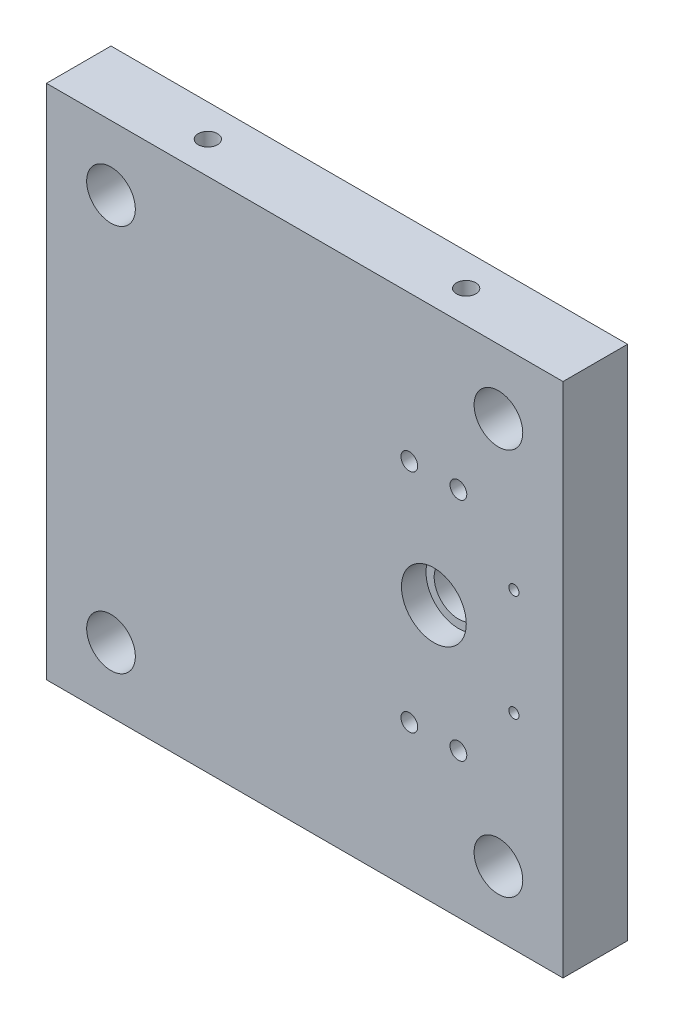
ISO-10303-21;
HEADER;
FILE_DESCRIPTION(('STEP AP214'),'2;1');
FILE_NAME('part.step','',(''),(''),'','','');
FILE_SCHEMA(('AUTOMOTIVE_DESIGN { 1 0 10303 214 1 1 1 1 }'));
ENDSEC;
DATA;
#1=APPLICATION_CONTEXT('core data for automotive mechanical design processes');
#2=APPLICATION_PROTOCOL_DEFINITION('international standard','automotive_design',2000,#1);
#3=PRODUCT_CONTEXT('',#1,'mechanical');
#4=PRODUCT('Part','Part','',(#3));
#5=PRODUCT_RELATED_PRODUCT_CATEGORY('part','',(#4));
#6=PRODUCT_DEFINITION_FORMATION('','',#4);
#7=PRODUCT_DEFINITION_CONTEXT('part definition',#1,'design');
#8=PRODUCT_DEFINITION('design','',#6,#7);
#9=PRODUCT_DEFINITION_SHAPE('','',#8);
#10=(LENGTH_UNIT() NAMED_UNIT(*) SI_UNIT(.MILLI.,.METRE.));
#11=(NAMED_UNIT(*) PLANE_ANGLE_UNIT() SI_UNIT($,.RADIAN.));
#12=(NAMED_UNIT(*) SI_UNIT($,.STERADIAN.) SOLID_ANGLE_UNIT());
#13=UNCERTAINTY_MEASURE_WITH_UNIT(LENGTH_MEASURE(1.E-05),#10,'distance_accuracy_value','');
#14=(GEOMETRIC_REPRESENTATION_CONTEXT(3) GLOBAL_UNCERTAINTY_ASSIGNED_CONTEXT((#13)) GLOBAL_UNIT_ASSIGNED_CONTEXT((#10,
#11,#12)) REPRESENTATION_CONTEXT('',''));
#15=CARTESIAN_POINT('',(0.,0.,0.));
#16=DIRECTION('',(0.,0.,1.));
#17=DIRECTION('',(1.,0.,0.));
#18=AXIS2_PLACEMENT_3D('',#15,#16,#17);
#19=CARTESIAN_POINT('',(-25.4,-38.1,6.35));
#20=DIRECTION('',(0.,-1.,0.));
#21=DIRECTION('',(0.,0.,-1.));
#22=AXIS2_PLACEMENT_3D('',#19,#20,#21);
#23=CONICAL_SURFACE('',#22,1.89864999999999,1.02974425867665);
#24=CARTESIAN_POINT('',(-25.4,-38.1,6.35));
#25=DIRECTION('',(0.,1.,0.));
#26=DIRECTION('',(0.,0.,1.));
#27=AXIS2_PLACEMENT_3D('',#24,#25,#26);
#28=CIRCLE('',#27,1.89865);
#29=CARTESIAN_POINT('',(-25.4,-38.1,8.24865));
#30=VERTEX_POINT('',#29);
#31=EDGE_CURVE('E190',#30,#30,#28,.F.);
#32=ORIENTED_EDGE('',*,*,#31,.T.);
#33=EDGE_LOOP('',(#32));
#34=FACE_BOUND('',#33,.T.);
#35=CARTESIAN_POINT('',(-25.4,-36.9591759856833,6.35));
#36=VERTEX_POINT('',#35);
#37=VERTEX_LOOP('',#36);
#38=FACE_BOUND('',#37,.T.);
#39=ADVANCED_FACE('F16',(#34,#38),#23,.F.);
#40=CARTESIAN_POINT('',(25.4,-38.1,6.35));
#41=DIRECTION('',(0.,-1.,0.));
#42=DIRECTION('',(0.,0.,-1.));
#43=AXIS2_PLACEMENT_3D('',#40,#41,#42);
#44=CONICAL_SURFACE('',#43,1.89865,1.02974425867665);
#45=CARTESIAN_POINT('',(25.4,-36.9591759856833,6.35));
#46=VERTEX_POINT('',#45);
#47=VERTEX_LOOP('',#46);
#48=FACE_BOUND('',#47,.T.);
#49=CARTESIAN_POINT('',(25.4,-38.1,6.35));
#50=DIRECTION('',(0.,-1.,0.));
#51=DIRECTION('',(0.,0.,-1.));
#52=AXIS2_PLACEMENT_3D('',#49,#50,#51);
#53=CIRCLE('',#52,1.89865);
#54=CARTESIAN_POINT('',(25.4,-38.1,4.45135));
#55=VERTEX_POINT('',#54);
#56=EDGE_CURVE('E185',#55,#55,#53,.T.);
#57=ORIENTED_EDGE('',*,*,#56,.T.);
#58=EDGE_LOOP('',(#57));
#59=FACE_BOUND('',#58,.T.);
#60=ADVANCED_FACE('F67',(#48,#59),#44,.F.);
#61=CARTESIAN_POINT('',(-25.4,38.1,6.35));
#62=DIRECTION('',(0.,1.,0.));
#63=DIRECTION('',(0.,0.,1.));
#64=AXIS2_PLACEMENT_3D('',#61,#62,#63);
#65=CONICAL_SURFACE('',#64,1.89865,1.02974425867665);
#66=CARTESIAN_POINT('',(-25.4,36.9591759856833,6.35));
#67=VERTEX_POINT('',#66);
#68=VERTEX_LOOP('',#67);
#69=FACE_BOUND('',#68,.T.);
#70=CARTESIAN_POINT('',(-25.4,38.1,6.35));
#71=DIRECTION('',(0.,1.,0.));
#72=DIRECTION('',(0.,0.,1.));
#73=AXIS2_PLACEMENT_3D('',#70,#71,#72);
#74=CIRCLE('',#73,1.89865);
#75=CARTESIAN_POINT('',(-25.4,38.1,8.24865));
#76=VERTEX_POINT('',#75);
#77=EDGE_CURVE('E183',#76,#76,#74,.T.);
#78=ORIENTED_EDGE('',*,*,#77,.T.);
#79=EDGE_LOOP('',(#78));
#80=FACE_BOUND('',#79,.T.);
#81=ADVANCED_FACE('F73',(#69,#80),#65,.F.);
#82=CARTESIAN_POINT('',(25.4,38.1,6.35));
#83=DIRECTION('',(0.,1.,0.));
#84=DIRECTION('',(0.,0.,1.));
#85=AXIS2_PLACEMENT_3D('',#82,#83,#84);
#86=CONICAL_SURFACE('',#85,1.89864999999999,1.02974425867665);
#87=CARTESIAN_POINT('',(25.4,38.1,6.35));
#88=DIRECTION('',(0.,-1.,0.));
#89=DIRECTION('',(0.,0.,-1.));
#90=AXIS2_PLACEMENT_3D('',#87,#88,#89);
#91=CIRCLE('',#90,1.89865);
#92=CARTESIAN_POINT('',(25.4,38.1,4.45135));
#93=VERTEX_POINT('',#92);
#94=EDGE_CURVE('E184',#93,#93,#91,.F.);
#95=ORIENTED_EDGE('',*,*,#94,.T.);
#96=EDGE_LOOP('',(#95));
#97=FACE_BOUND('',#96,.T.);
#98=CARTESIAN_POINT('',(25.4,36.9591759856833,6.35));
#99=VERTEX_POINT('',#98);
#100=VERTEX_LOOP('',#99);
#101=FACE_BOUND('',#100,.T.);
#102=ADVANCED_FACE('F171',(#97,#101),#86,.F.);
#103=CARTESIAN_POINT('',(25.4,0.,12.7));
#104=DIRECTION('',(0.,0.,1.));
#105=DIRECTION('',(1.,0.,0.));
#106=AXIS2_PLACEMENT_3D('',#103,#104,#105);
#107=CYLINDRICAL_SURFACE('',#106,6.3754);
#108=CARTESIAN_POINT('',(25.4,0.,7.874));
#109=DIRECTION('',(0.,0.,1.));
#110=DIRECTION('',(1.,0.,0.));
#111=AXIS2_PLACEMENT_3D('',#108,#109,#110);
#112=CIRCLE('',#111,6.3754);
#113=CARTESIAN_POINT('',(31.7754,0.,7.874));
#114=VERTEX_POINT('',#113);
#115=EDGE_CURVE('E19',#114,#114,#112,.T.);
#116=ORIENTED_EDGE('',*,*,#115,.F.);
#117=EDGE_LOOP('',(#116));
#118=FACE_BOUND('',#117,.T.);
#119=CARTESIAN_POINT('',(25.4,0.,12.7));
#120=DIRECTION('',(0.,0.,1.));
#121=DIRECTION('',(1.,0.,0.));
#122=AXIS2_PLACEMENT_3D('',#119,#120,#121);
#123=CIRCLE('',#122,6.3754);
#124=CARTESIAN_POINT('',(31.7754,0.,12.7));
#125=VERTEX_POINT('',#124);
#126=EDGE_CURVE('E272',#125,#125,#123,.F.);
#127=ORIENTED_EDGE('',*,*,#126,.F.);
#128=EDGE_LOOP('',(#127));
#129=FACE_BOUND('',#128,.T.);
#130=ADVANCED_FACE('F167',(#118,#129),#107,.F.);
#131=CARTESIAN_POINT('',(-25.4,-36.2671347849675,6.35));
#132=DIRECTION('',(0.,1.,0.));
#133=DIRECTION('',(0.,0.,1.));
#134=AXIS2_PLACEMENT_3D('',#131,#132,#133);
#135=CYLINDRICAL_SURFACE('',#134,1.89865);
#136=CARTESIAN_POINT('',(-25.4,-50.8,6.35));
#137=DIRECTION('',(0.,1.,0.));
#138=DIRECTION('',(0.,0.,1.));
#139=AXIS2_PLACEMENT_3D('',#136,#137,#138);
#140=CIRCLE('',#139,1.89865);
#141=CARTESIAN_POINT('',(-25.4,-50.8,8.24865));
#142=VERTEX_POINT('',#141);
#143=EDGE_CURVE('E269',#142,#142,#140,.T.);
#144=ORIENTED_EDGE('',*,*,#143,.F.);
#145=EDGE_LOOP('',(#144));
#146=FACE_BOUND('',#145,.T.);
#147=ORIENTED_EDGE('',*,*,#31,.F.);
#148=EDGE_LOOP('',(#147));
#149=FACE_BOUND('',#148,.T.);
#150=ADVANCED_FACE('F163',(#146,#149),#135,.F.);
#151=CARTESIAN_POINT('',(25.4,-36.2671347849675,6.35));
#152=DIRECTION('',(0.,-1.,0.));
#153=DIRECTION('',(0.,0.,-1.));
#154=AXIS2_PLACEMENT_3D('',#151,#152,#153);
#155=CYLINDRICAL_SURFACE('',#154,1.89865);
#156=ORIENTED_EDGE('',*,*,#56,.F.);
#157=EDGE_LOOP('',(#156));
#158=FACE_BOUND('',#157,.T.);
#159=CARTESIAN_POINT('',(25.4,-50.8,6.35));
#160=DIRECTION('',(0.,-1.,0.));
#161=DIRECTION('',(0.,0.,-1.));
#162=AXIS2_PLACEMENT_3D('',#159,#160,#161);
#163=CIRCLE('',#162,1.89865);
#164=CARTESIAN_POINT('',(25.4,-50.8,4.45135));
#165=VERTEX_POINT('',#164);
#166=EDGE_CURVE('E265',#165,#165,#163,.F.);
#167=ORIENTED_EDGE('',*,*,#166,.F.);
#168=EDGE_LOOP('',(#167));
#169=FACE_BOUND('',#168,.T.);
#170=ADVANCED_FACE('F159',(#158,#169),#155,.F.);
#171=CARTESIAN_POINT('',(-25.4,36.2671347849675,6.35));
#172=DIRECTION('',(0.,1.,0.));
#173=DIRECTION('',(0.,0.,1.));
#174=AXIS2_PLACEMENT_3D('',#171,#172,#173);
#175=CYLINDRICAL_SURFACE('',#174,1.89865);
#176=ORIENTED_EDGE('',*,*,#77,.F.);
#177=EDGE_LOOP('',(#176));
#178=FACE_BOUND('',#177,.T.);
#179=CARTESIAN_POINT('',(-25.4,50.8,6.35));
#180=DIRECTION('',(0.,1.,0.));
#181=DIRECTION('',(0.,0.,1.));
#182=AXIS2_PLACEMENT_3D('',#179,#180,#181);
#183=CIRCLE('',#182,1.89865);
#184=CARTESIAN_POINT('',(-25.4,50.8,8.24865));
#185=VERTEX_POINT('',#184);
#186=EDGE_CURVE('E262',#185,#185,#183,.F.);
#187=ORIENTED_EDGE('',*,*,#186,.F.);
#188=EDGE_LOOP('',(#187));
#189=FACE_BOUND('',#188,.T.);
#190=ADVANCED_FACE('F155',(#178,#189),#175,.F.);
#191=CARTESIAN_POINT('',(25.4,36.2671347849675,6.35));
#192=DIRECTION('',(0.,-1.,0.));
#193=DIRECTION('',(0.,0.,-1.));
#194=AXIS2_PLACEMENT_3D('',#191,#192,#193);
#195=CYLINDRICAL_SURFACE('',#194,1.89865);
#196=CARTESIAN_POINT('',(25.4,50.8,6.35));
#197=DIRECTION('',(0.,-1.,0.));
#198=DIRECTION('',(0.,0.,-1.));
#199=AXIS2_PLACEMENT_3D('',#196,#197,#198);
#200=CIRCLE('',#199,1.89865);
#201=CARTESIAN_POINT('',(25.4,50.8,4.45135));
#202=VERTEX_POINT('',#201);
#203=EDGE_CURVE('E259',#202,#202,#200,.T.);
#204=ORIENTED_EDGE('',*,*,#203,.F.);
#205=EDGE_LOOP('',(#204));
#206=FACE_BOUND('',#205,.T.);
#207=ORIENTED_EDGE('',*,*,#94,.F.);
#208=EDGE_LOOP('',(#207));
#209=FACE_BOUND('',#208,.T.);
#210=ADVANCED_FACE('F151',(#206,#209),#195,.F.);
#211=CARTESIAN_POINT('',(0.,0.,7.874));
#212=DIRECTION('',(0.,0.,1.));
#213=DIRECTION('',(1.,0.,0.));
#214=AXIS2_PLACEMENT_3D('',#211,#212,#213);
#215=PLANE('',#214);
#216=CARTESIAN_POINT('',(25.4,0.,7.874));
#217=DIRECTION('',(0.,0.,1.));
#218=DIRECTION('',(1.,0.,0.));
#219=AXIS2_PLACEMENT_3D('',#216,#217,#218);
#220=CIRCLE('',#219,4.7625);
#221=CARTESIAN_POINT('',(30.1625,0.,7.874));
#222=VERTEX_POINT('',#221);
#223=EDGE_CURVE('E244',#222,#222,#220,.F.);
#224=ORIENTED_EDGE('',*,*,#223,.T.);
#225=EDGE_LOOP('',(#224));
#226=FACE_BOUND('',#225,.T.);
#227=ORIENTED_EDGE('',*,*,#115,.T.);
#228=EDGE_LOOP('',(#227));
#229=FACE_BOUND('',#228,.T.);
#230=ADVANCED_FACE('F147',(#226,#229),#215,.T.);
#231=CARTESIAN_POINT('',(0.,0.,12.7));
#232=DIRECTION('',(0.,0.,1.));
#233=DIRECTION('',(1.,0.,0.));
#234=AXIS2_PLACEMENT_3D('',#231,#232,#233);
#235=PLANE('',#234);
#236=CARTESIAN_POINT('',(20.574,22.098,12.7));
#237=DIRECTION('',(0.,0.,-1.));
#238=DIRECTION('',(-1.,0.,0.));
#239=AXIS2_PLACEMENT_3D('',#236,#237,#238);
#240=CIRCLE('',#239,1.64973);
#241=CARTESIAN_POINT('',(18.92427,22.098,12.7));
#242=VERTEX_POINT('',#241);
#243=EDGE_CURVE('E225',#242,#242,#240,.T.);
#244=ORIENTED_EDGE('',*,*,#243,.T.);
#245=EDGE_LOOP('',(#244));
#246=FACE_BOUND('',#245,.T.);
#247=CARTESIAN_POINT('',(30.226,22.098,12.7));
#248=DIRECTION('',(0.,0.,-1.));
#249=DIRECTION('',(-1.,0.,0.));
#250=AXIS2_PLACEMENT_3D('',#247,#248,#249);
#251=CIRCLE('',#250,1.64973);
#252=CARTESIAN_POINT('',(28.57627,22.098,12.7));
#253=VERTEX_POINT('',#252);
#254=EDGE_CURVE('E229',#253,#253,#251,.T.);
#255=ORIENTED_EDGE('',*,*,#254,.T.);
#256=EDGE_LOOP('',(#255));
#257=FACE_BOUND('',#256,.T.);
#258=CARTESIAN_POINT('',(20.574,-22.352,12.7));
#259=DIRECTION('',(0.,0.,-1.));
#260=DIRECTION('',(-1.,0.,0.));
#261=AXIS2_PLACEMENT_3D('',#258,#259,#260);
#262=CIRCLE('',#261,1.64973);
#263=CARTESIAN_POINT('',(18.92427,-22.352,12.7));
#264=VERTEX_POINT('',#263);
#265=EDGE_CURVE('E232',#264,#264,#262,.T.);
#266=ORIENTED_EDGE('',*,*,#265,.T.);
#267=EDGE_LOOP('',(#266));
#268=FACE_BOUND('',#267,.T.);
#269=CARTESIAN_POINT('',(30.226,-22.352,12.7));
#270=DIRECTION('',(0.,0.,-1.));
#271=DIRECTION('',(-1.,0.,0.));
#272=AXIS2_PLACEMENT_3D('',#269,#270,#271);
#273=CIRCLE('',#272,1.64973);
#274=CARTESIAN_POINT('',(28.57627,-22.352,12.7));
#275=VERTEX_POINT('',#274);
#276=EDGE_CURVE('E235',#275,#275,#273,.T.);
#277=ORIENTED_EDGE('',*,*,#276,.T.);
#278=EDGE_LOOP('',(#277));
#279=FACE_BOUND('',#278,.T.);
#280=CARTESIAN_POINT('',(41.148,10.4775,12.7));
#281=DIRECTION('',(0.,0.,1.));
#282=DIRECTION('',(1.,0.,0.));
#283=AXIS2_PLACEMENT_3D('',#280,#281,#282);
#284=CIRCLE('',#283,0.9921875);
#285=CARTESIAN_POINT('',(42.1401875,10.4775,12.7));
#286=VERTEX_POINT('',#285);
#287=EDGE_CURVE('E238',#286,#286,#284,.F.);
#288=ORIENTED_EDGE('',*,*,#287,.T.);
#289=EDGE_LOOP('',(#288));
#290=FACE_BOUND('',#289,.T.);
#291=CARTESIAN_POINT('',(41.148,-10.4775,12.7));
#292=DIRECTION('',(0.,0.,1.));
#293=DIRECTION('',(1.,0.,0.));
#294=AXIS2_PLACEMENT_3D('',#291,#292,#293);
#295=CIRCLE('',#294,0.9921875);
#296=CARTESIAN_POINT('',(42.1401875,-10.4775,12.7));
#297=VERTEX_POINT('',#296);
#298=EDGE_CURVE('E241',#297,#297,#295,.F.);
#299=ORIENTED_EDGE('',*,*,#298,.T.);
#300=EDGE_LOOP('',(#299));
#301=FACE_BOUND('',#300,.T.);
#302=ORIENTED_EDGE('',*,*,#126,.T.);
#303=EDGE_LOOP('',(#302));
#304=FACE_BOUND('',#303,.T.);
#305=CARTESIAN_POINT('',(-38.1,-38.1,12.7));
#306=DIRECTION('',(0.,0.,1.));
#307=DIRECTION('',(1.,0.,0.));
#308=AXIS2_PLACEMENT_3D('',#305,#306,#307);
#309=CIRCLE('',#308,4.7879);
#310=CARTESIAN_POINT('',(-33.3121,-38.1,12.7));
#311=VERTEX_POINT('',#310);
#312=EDGE_CURVE('E247',#311,#311,#309,.F.);
#313=ORIENTED_EDGE('',*,*,#312,.T.);
#314=EDGE_LOOP('',(#313));
#315=FACE_BOUND('',#314,.T.);
#316=CARTESIAN_POINT('',(38.1,-38.1,12.7));
#317=DIRECTION('',(0.,0.,1.));
#318=DIRECTION('',(1.,0.,0.));
#319=AXIS2_PLACEMENT_3D('',#316,#317,#318);
#320=CIRCLE('',#319,4.7879);
#321=CARTESIAN_POINT('',(42.8879,-38.1,12.7));
#322=VERTEX_POINT('',#321);
#323=EDGE_CURVE('E250',#322,#322,#320,.F.);
#324=ORIENTED_EDGE('',*,*,#323,.T.);
#325=EDGE_LOOP('',(#324));
#326=FACE_BOUND('',#325,.T.);
#327=CARTESIAN_POINT('',(38.1,38.1,12.7));
#328=DIRECTION('',(0.,0.,1.));
#329=DIRECTION('',(1.,0.,0.));
#330=AXIS2_PLACEMENT_3D('',#327,#328,#329);
#331=CIRCLE('',#330,4.7879);
#332=CARTESIAN_POINT('',(42.8879,38.1,12.7));
#333=VERTEX_POINT('',#332);
#334=EDGE_CURVE('E253',#333,#333,#331,.F.);
#335=ORIENTED_EDGE('',*,*,#334,.T.);
#336=EDGE_LOOP('',(#335));
#337=FACE_BOUND('',#336,.T.);
#338=CARTESIAN_POINT('',(-38.1,38.1,12.7));
#339=DIRECTION('',(0.,0.,1.));
#340=DIRECTION('',(1.,0.,0.));
#341=AXIS2_PLACEMENT_3D('',#338,#339,#340);
#342=CIRCLE('',#341,4.7879);
#343=CARTESIAN_POINT('',(-33.3121,38.1,12.7));
#344=VERTEX_POINT('',#343);
#345=EDGE_CURVE('E256',#344,#344,#342,.F.);
#346=ORIENTED_EDGE('',*,*,#345,.T.);
#347=EDGE_LOOP('',(#346));
#348=FACE_BOUND('',#347,.T.);
#349=DIRECTION('',(1.,0.,0.));
#350=VECTOR('',#349,1.);
#351=CARTESIAN_POINT('',(50.8,50.8,12.7));
#352=LINE('',#351,#350);
#353=CARTESIAN_POINT('',(-50.8,50.8,12.7));
#354=VERTEX_POINT('',#353);
#355=CARTESIAN_POINT('',(50.8,50.8,12.7));
#356=VERTEX_POINT('',#355);
#357=EDGE_CURVE('E294',#354,#356,#352,.T.);
#358=ORIENTED_EDGE('',*,*,#357,.F.);
#359=DIRECTION('',(0.,1.,0.));
#360=VECTOR('',#359,1.);
#361=CARTESIAN_POINT('',(-50.8,50.8,12.7));
#362=LINE('',#361,#360);
#363=CARTESIAN_POINT('',(-50.8,-50.8,12.7));
#364=VERTEX_POINT('',#363);
#365=EDGE_CURVE('E274',#364,#354,#362,.T.);
#366=ORIENTED_EDGE('',*,*,#365,.F.);
#367=DIRECTION('',(1.,0.,0.));
#368=VECTOR('',#367,1.);
#369=CARTESIAN_POINT('',(-50.8,-50.8,12.7));
#370=LINE('',#369,#368);
#371=CARTESIAN_POINT('',(50.8,-50.8,12.7));
#372=VERTEX_POINT('',#371);
#373=EDGE_CURVE('E277',#372,#364,#370,.F.);
#374=ORIENTED_EDGE('',*,*,#373,.F.);
#375=DIRECTION('',(0.,1.,0.));
#376=VECTOR('',#375,1.);
#377=CARTESIAN_POINT('',(50.8,-50.8,12.7));
#378=LINE('',#377,#376);
#379=EDGE_CURVE('E268',#356,#372,#378,.F.);
#380=ORIENTED_EDGE('',*,*,#379,.F.);
#381=EDGE_LOOP('',(#358,#366,#374,#380));
#382=FACE_BOUND('',#381,.T.);
#383=ADVANCED_FACE('F143',(#246,#257,#268,#279,#290,#301,#304,#315,#326,#337,#348,#382),#235,.T.);
#384=CARTESIAN_POINT('',(-50.8,50.8,0.));
#385=DIRECTION('',(-1.,0.,0.));
#386=DIRECTION('',(0.,0.,1.));
#387=AXIS2_PLACEMENT_3D('',#384,#385,#386);
#388=PLANE('',#387);
#389=DIRECTION('',(0.,0.,1.));
#390=VECTOR('',#389,1.);
#391=CARTESIAN_POINT('',(-50.8,50.8,0.));
#392=LINE('',#391,#390);
#393=CARTESIAN_POINT('',(-50.8,50.8,0.));
#394=VERTEX_POINT('',#393);
#395=EDGE_CURVE('E292',#394,#354,#392,.T.);
#396=ORIENTED_EDGE('',*,*,#395,.F.);
#397=DIRECTION('',(0.,1.,0.));
#398=VECTOR('',#397,1.);
#399=CARTESIAN_POINT('',(-50.8,0.,0.));
#400=LINE('',#399,#398);
#401=CARTESIAN_POINT('',(-50.8,-50.8,0.));
#402=VERTEX_POINT('',#401);
#403=EDGE_CURVE('E228',#394,#402,#400,.F.);
#404=ORIENTED_EDGE('',*,*,#403,.T.);
#405=DIRECTION('',(0.,0.,-1.));
#406=VECTOR('',#405,1.);
#407=CARTESIAN_POINT('',(-50.8,-50.8,0.));
#408=LINE('',#407,#406);
#409=EDGE_CURVE('E271',#364,#402,#408,.T.);
#410=ORIENTED_EDGE('',*,*,#409,.F.);
#411=ORIENTED_EDGE('',*,*,#365,.T.);
#412=EDGE_LOOP('',(#396,#404,#410,#411));
#413=FACE_BOUND('',#412,.T.);
#414=ADVANCED_FACE('F139',(#413),#388,.T.);
#415=CARTESIAN_POINT('',(-50.8,-50.8,0.));
#416=DIRECTION('',(0.,-1.,0.));
#417=DIRECTION('',(0.,0.,-1.));
#418=AXIS2_PLACEMENT_3D('',#415,#416,#417);
#419=PLANE('',#418);
#420=ORIENTED_EDGE('',*,*,#166,.T.);
#421=EDGE_LOOP('',(#420));
#422=FACE_BOUND('',#421,.T.);
#423=ORIENTED_EDGE('',*,*,#143,.T.);
#424=EDGE_LOOP('',(#423));
#425=FACE_BOUND('',#424,.T.);
#426=ORIENTED_EDGE('',*,*,#409,.T.);
#427=DIRECTION('',(1.,0.,0.));
#428=VECTOR('',#427,1.);
#429=CARTESIAN_POINT('',(0.,-50.8,0.));
#430=LINE('',#429,#428);
#431=CARTESIAN_POINT('',(50.8,-50.8,0.));
#432=VERTEX_POINT('',#431);
#433=EDGE_CURVE('E299',#402,#432,#430,.T.);
#434=ORIENTED_EDGE('',*,*,#433,.T.);
#435=DIRECTION('',(0.,0.,-1.));
#436=VECTOR('',#435,1.);
#437=CARTESIAN_POINT('',(50.8,-50.8,0.));
#438=LINE('',#437,#436);
#439=EDGE_CURVE('E290',#372,#432,#438,.T.);
#440=ORIENTED_EDGE('',*,*,#439,.F.);
#441=ORIENTED_EDGE('',*,*,#373,.T.);
#442=EDGE_LOOP('',(#426,#434,#440,#441));
#443=FACE_BOUND('',#442,.T.);
#444=ADVANCED_FACE('F135',(#422,#425,#443),#419,.T.);
#445=CARTESIAN_POINT('',(50.8,-50.8,0.));
#446=DIRECTION('',(1.,0.,0.));
#447=DIRECTION('',(0.,0.,-1.));
#448=AXIS2_PLACEMENT_3D('',#445,#446,#447);
#449=PLANE('',#448);
#450=ORIENTED_EDGE('',*,*,#439,.T.);
#451=DIRECTION('',(0.,1.,0.));
#452=VECTOR('',#451,1.);
#453=CARTESIAN_POINT('',(50.8,0.,0.));
#454=LINE('',#453,#452);
#455=CARTESIAN_POINT('',(50.8,50.8,0.));
#456=VERTEX_POINT('',#455);
#457=EDGE_CURVE('E302',#432,#456,#454,.T.);
#458=ORIENTED_EDGE('',*,*,#457,.T.);
#459=DIRECTION('',(0.,0.,1.));
#460=VECTOR('',#459,1.);
#461=CARTESIAN_POINT('',(50.8,50.8,0.));
#462=LINE('',#461,#460);
#463=EDGE_CURVE('E34',#356,#456,#462,.F.);
#464=ORIENTED_EDGE('',*,*,#463,.F.);
#465=ORIENTED_EDGE('',*,*,#379,.T.);
#466=EDGE_LOOP('',(#450,#458,#464,#465));
#467=FACE_BOUND('',#466,.T.);
#468=ADVANCED_FACE('F131',(#467),#449,.T.);
#469=CARTESIAN_POINT('',(50.8,50.8,0.));
#470=DIRECTION('',(0.,1.,0.));
#471=DIRECTION('',(0.,0.,1.));
#472=AXIS2_PLACEMENT_3D('',#469,#470,#471);
#473=PLANE('',#472);
#474=ORIENTED_EDGE('',*,*,#203,.T.);
#475=EDGE_LOOP('',(#474));
#476=FACE_BOUND('',#475,.T.);
#477=ORIENTED_EDGE('',*,*,#186,.T.);
#478=EDGE_LOOP('',(#477));
#479=FACE_BOUND('',#478,.T.);
#480=ORIENTED_EDGE('',*,*,#463,.T.);
#481=DIRECTION('',(1.,0.,0.));
#482=VECTOR('',#481,1.);
#483=CARTESIAN_POINT('',(0.,50.8,0.));
#484=LINE('',#483,#482);
#485=EDGE_CURVE('E224',#456,#394,#484,.F.);
#486=ORIENTED_EDGE('',*,*,#485,.T.);
#487=ORIENTED_EDGE('',*,*,#395,.T.);
#488=ORIENTED_EDGE('',*,*,#357,.T.);
#489=EDGE_LOOP('',(#480,#486,#487,#488));
#490=FACE_BOUND('',#489,.T.);
#491=ADVANCED_FACE('F127',(#476,#479,#490),#473,.T.);
#492=CARTESIAN_POINT('',(-38.1,38.1,12.7));
#493=DIRECTION('',(0.,0.,1.));
#494=DIRECTION('',(1.,0.,0.));
#495=AXIS2_PLACEMENT_3D('',#492,#493,#494);
#496=CYLINDRICAL_SURFACE('',#495,4.7879);
#497=ORIENTED_EDGE('',*,*,#345,.F.);
#498=EDGE_LOOP('',(#497));
#499=FACE_BOUND('',#498,.T.);
#500=CARTESIAN_POINT('',(-38.1,38.1,0.));
#501=DIRECTION('',(0.,0.,1.));
#502=DIRECTION('',(1.,0.,0.));
#503=AXIS2_PLACEMENT_3D('',#500,#501,#502);
#504=CIRCLE('',#503,4.7879);
#505=CARTESIAN_POINT('',(-33.3121,38.1,0.));
#506=VERTEX_POINT('',#505);
#507=EDGE_CURVE('E221',#506,#506,#504,.F.);
#508=ORIENTED_EDGE('',*,*,#507,.T.);
#509=EDGE_LOOP('',(#508));
#510=FACE_BOUND('',#509,.T.);
#511=ADVANCED_FACE('F123',(#499,#510),#496,.F.);
#512=CARTESIAN_POINT('',(38.1,38.1,12.7));
#513=DIRECTION('',(0.,0.,1.));
#514=DIRECTION('',(1.,0.,0.));
#515=AXIS2_PLACEMENT_3D('',#512,#513,#514);
#516=CYLINDRICAL_SURFACE('',#515,4.7879);
#517=ORIENTED_EDGE('',*,*,#334,.F.);
#518=EDGE_LOOP('',(#517));
#519=FACE_BOUND('',#518,.T.);
#520=CARTESIAN_POINT('',(38.1,38.1,0.));
#521=DIRECTION('',(0.,0.,1.));
#522=DIRECTION('',(1.,0.,0.));
#523=AXIS2_PLACEMENT_3D('',#520,#521,#522);
#524=CIRCLE('',#523,4.7879);
#525=CARTESIAN_POINT('',(42.8879,38.1,0.));
#526=VERTEX_POINT('',#525);
#527=EDGE_CURVE('E218',#526,#526,#524,.F.);
#528=ORIENTED_EDGE('',*,*,#527,.T.);
#529=EDGE_LOOP('',(#528));
#530=FACE_BOUND('',#529,.T.);
#531=ADVANCED_FACE('F119',(#519,#530),#516,.F.);
#532=CARTESIAN_POINT('',(38.1,-38.1,12.7));
#533=DIRECTION('',(0.,0.,1.));
#534=DIRECTION('',(1.,0.,0.));
#535=AXIS2_PLACEMENT_3D('',#532,#533,#534);
#536=CYLINDRICAL_SURFACE('',#535,4.7879);
#537=ORIENTED_EDGE('',*,*,#323,.F.);
#538=EDGE_LOOP('',(#537));
#539=FACE_BOUND('',#538,.T.);
#540=CARTESIAN_POINT('',(38.1,-38.1,0.));
#541=DIRECTION('',(0.,0.,1.));
#542=DIRECTION('',(1.,0.,0.));
#543=AXIS2_PLACEMENT_3D('',#540,#541,#542);
#544=CIRCLE('',#543,4.7879);
#545=CARTESIAN_POINT('',(42.8879,-38.1,0.));
#546=VERTEX_POINT('',#545);
#547=EDGE_CURVE('E215',#546,#546,#544,.F.);
#548=ORIENTED_EDGE('',*,*,#547,.T.);
#549=EDGE_LOOP('',(#548));
#550=FACE_BOUND('',#549,.T.);
#551=ADVANCED_FACE('F115',(#539,#550),#536,.F.);
#552=CARTESIAN_POINT('',(-38.1,-38.1,12.7));
#553=DIRECTION('',(0.,0.,1.));
#554=DIRECTION('',(1.,0.,0.));
#555=AXIS2_PLACEMENT_3D('',#552,#553,#554);
#556=CYLINDRICAL_SURFACE('',#555,4.7879);
#557=ORIENTED_EDGE('',*,*,#312,.F.);
#558=EDGE_LOOP('',(#557));
#559=FACE_BOUND('',#558,.T.);
#560=CARTESIAN_POINT('',(-38.1,-38.1,0.));
#561=DIRECTION('',(0.,0.,1.));
#562=DIRECTION('',(1.,0.,0.));
#563=AXIS2_PLACEMENT_3D('',#560,#561,#562);
#564=CIRCLE('',#563,4.7879);
#565=CARTESIAN_POINT('',(-33.3121,-38.1,0.));
#566=VERTEX_POINT('',#565);
#567=EDGE_CURVE('E212',#566,#566,#564,.F.);
#568=ORIENTED_EDGE('',*,*,#567,.T.);
#569=EDGE_LOOP('',(#568));
#570=FACE_BOUND('',#569,.T.);
#571=ADVANCED_FACE('F111',(#559,#570),#556,.F.);
#572=CARTESIAN_POINT('',(25.4,0.,7.874));
#573=DIRECTION('',(0.,0.,1.));
#574=DIRECTION('',(1.,0.,0.));
#575=AXIS2_PLACEMENT_3D('',#572,#573,#574);
#576=CYLINDRICAL_SURFACE('',#575,4.7625);
#577=ORIENTED_EDGE('',*,*,#223,.F.);
#578=EDGE_LOOP('',(#577));
#579=FACE_BOUND('',#578,.T.);
#580=CARTESIAN_POINT('',(25.4,0.,0.));
#581=DIRECTION('',(0.,0.,1.));
#582=DIRECTION('',(1.,0.,0.));
#583=AXIS2_PLACEMENT_3D('',#580,#581,#582);
#584=CIRCLE('',#583,4.7625);
#585=CARTESIAN_POINT('',(30.1625,0.,0.));
#586=VERTEX_POINT('',#585);
#587=EDGE_CURVE('E209',#586,#586,#584,.F.);
#588=ORIENTED_EDGE('',*,*,#587,.T.);
#589=EDGE_LOOP('',(#588));
#590=FACE_BOUND('',#589,.T.);
#591=ADVANCED_FACE('F107',(#579,#590),#576,.F.);
#592=CARTESIAN_POINT('',(41.148,-10.4775,12.7));
#593=DIRECTION('',(0.,0.,1.));
#594=DIRECTION('',(1.,0.,0.));
#595=AXIS2_PLACEMENT_3D('',#592,#593,#594);
#596=CYLINDRICAL_SURFACE('',#595,0.9921875);
#597=ORIENTED_EDGE('',*,*,#298,.F.);
#598=EDGE_LOOP('',(#597));
#599=FACE_BOUND('',#598,.T.);
#600=CARTESIAN_POINT('',(41.148,-10.4775,0.));
#601=DIRECTION('',(0.,0.,1.));
#602=DIRECTION('',(1.,0.,0.));
#603=AXIS2_PLACEMENT_3D('',#600,#601,#602);
#604=CIRCLE('',#603,0.9921875);
#605=CARTESIAN_POINT('',(42.1401875,-10.4775,0.));
#606=VERTEX_POINT('',#605);
#607=EDGE_CURVE('E206',#606,#606,#604,.F.);
#608=ORIENTED_EDGE('',*,*,#607,.T.);
#609=EDGE_LOOP('',(#608));
#610=FACE_BOUND('',#609,.T.);
#611=ADVANCED_FACE('F103',(#599,#610),#596,.F.);
#612=CARTESIAN_POINT('',(41.148,10.4775,12.7));
#613=DIRECTION('',(0.,0.,1.));
#614=DIRECTION('',(1.,0.,0.));
#615=AXIS2_PLACEMENT_3D('',#612,#613,#614);
#616=CYLINDRICAL_SURFACE('',#615,0.9921875);
#617=ORIENTED_EDGE('',*,*,#287,.F.);
#618=EDGE_LOOP('',(#617));
#619=FACE_BOUND('',#618,.T.);
#620=CARTESIAN_POINT('',(41.148,10.4775,0.));
#621=DIRECTION('',(0.,0.,1.));
#622=DIRECTION('',(1.,0.,0.));
#623=AXIS2_PLACEMENT_3D('',#620,#621,#622);
#624=CIRCLE('',#623,0.9921875);
#625=CARTESIAN_POINT('',(42.1401875,10.4775,0.));
#626=VERTEX_POINT('',#625);
#627=EDGE_CURVE('E203',#626,#626,#624,.F.);
#628=ORIENTED_EDGE('',*,*,#627,.T.);
#629=EDGE_LOOP('',(#628));
#630=FACE_BOUND('',#629,.T.);
#631=ADVANCED_FACE('F99',(#619,#630),#616,.F.);
#632=CARTESIAN_POINT('',(30.226,-22.352,12.7));
#633=DIRECTION('',(0.,0.,-1.));
#634=DIRECTION('',(-1.,0.,0.));
#635=AXIS2_PLACEMENT_3D('',#632,#633,#634);
#636=CYLINDRICAL_SURFACE('',#635,1.64973);
#637=ORIENTED_EDGE('',*,*,#276,.F.);
#638=EDGE_LOOP('',(#637));
#639=FACE_BOUND('',#638,.T.);
#640=CARTESIAN_POINT('',(30.226,-22.352,0.));
#641=DIRECTION('',(0.,0.,-1.));
#642=DIRECTION('',(-1.,0.,0.));
#643=AXIS2_PLACEMENT_3D('',#640,#641,#642);
#644=CIRCLE('',#643,1.64973);
#645=CARTESIAN_POINT('',(28.57627,-22.352,0.));
#646=VERTEX_POINT('',#645);
#647=EDGE_CURVE('E200',#646,#646,#644,.T.);
#648=ORIENTED_EDGE('',*,*,#647,.T.);
#649=EDGE_LOOP('',(#648));
#650=FACE_BOUND('',#649,.T.);
#651=ADVANCED_FACE('F95',(#639,#650),#636,.F.);
#652=CARTESIAN_POINT('',(20.574,-22.352,12.7));
#653=DIRECTION('',(0.,0.,-1.));
#654=DIRECTION('',(-1.,0.,0.));
#655=AXIS2_PLACEMENT_3D('',#652,#653,#654);
#656=CYLINDRICAL_SURFACE('',#655,1.64973);
#657=ORIENTED_EDGE('',*,*,#265,.F.);
#658=EDGE_LOOP('',(#657));
#659=FACE_BOUND('',#658,.T.);
#660=CARTESIAN_POINT('',(20.574,-22.352,0.));
#661=DIRECTION('',(0.,0.,-1.));
#662=DIRECTION('',(-1.,0.,0.));
#663=AXIS2_PLACEMENT_3D('',#660,#661,#662);
#664=CIRCLE('',#663,1.64973);
#665=CARTESIAN_POINT('',(18.92427,-22.352,0.));
#666=VERTEX_POINT('',#665);
#667=EDGE_CURVE('E197',#666,#666,#664,.T.);
#668=ORIENTED_EDGE('',*,*,#667,.T.);
#669=EDGE_LOOP('',(#668));
#670=FACE_BOUND('',#669,.T.);
#671=ADVANCED_FACE('F91',(#659,#670),#656,.F.);
#672=CARTESIAN_POINT('',(30.226,22.098,12.7));
#673=DIRECTION('',(0.,0.,-1.));
#674=DIRECTION('',(-1.,0.,0.));
#675=AXIS2_PLACEMENT_3D('',#672,#673,#674);
#676=CYLINDRICAL_SURFACE('',#675,1.64973);
#677=CARTESIAN_POINT('',(30.226,22.098,0.));
#678=DIRECTION('',(0.,0.,-1.));
#679=DIRECTION('',(-1.,0.,0.));
#680=AXIS2_PLACEMENT_3D('',#677,#678,#679);
#681=CIRCLE('',#680,1.64973);
#682=CARTESIAN_POINT('',(28.57627,22.098,0.));
#683=VERTEX_POINT('',#682);
#684=EDGE_CURVE('E25',#683,#683,#681,.T.);
#685=ORIENTED_EDGE('',*,*,#684,.T.);
#686=EDGE_LOOP('',(#685));
#687=FACE_BOUND('',#686,.T.);
#688=ORIENTED_EDGE('',*,*,#254,.F.);
#689=EDGE_LOOP('',(#688));
#690=FACE_BOUND('',#689,.T.);
#691=ADVANCED_FACE('F83',(#687,#690),#676,.F.);
#692=CARTESIAN_POINT('',(20.574,22.098,12.7));
#693=DIRECTION('',(0.,0.,-1.));
#694=DIRECTION('',(-1.,0.,0.));
#695=AXIS2_PLACEMENT_3D('',#692,#693,#694);
#696=CYLINDRICAL_SURFACE('',#695,1.64973);
#697=CARTESIAN_POINT('',(20.574,22.098,0.));
#698=DIRECTION('',(0.,0.,-1.));
#699=DIRECTION('',(-1.,0.,0.));
#700=AXIS2_PLACEMENT_3D('',#697,#698,#699);
#701=CIRCLE('',#700,1.64973);
#702=CARTESIAN_POINT('',(18.92427,22.098,0.));
#703=VERTEX_POINT('',#702);
#704=EDGE_CURVE('E11',#703,#703,#701,.T.);
#705=ORIENTED_EDGE('',*,*,#704,.T.);
#706=EDGE_LOOP('',(#705));
#707=FACE_BOUND('',#706,.T.);
#708=ORIENTED_EDGE('',*,*,#243,.F.);
#709=EDGE_LOOP('',(#708));
#710=FACE_BOUND('',#709,.T.);
#711=ADVANCED_FACE('F77',(#707,#710),#696,.F.);
#712=CARTESIAN_POINT('',(0.,0.,0.));
#713=DIRECTION('',(0.,0.,1.));
#714=DIRECTION('',(1.,0.,0.));
#715=AXIS2_PLACEMENT_3D('',#712,#713,#714);
#716=PLANE('',#715);
#717=ORIENTED_EDGE('',*,*,#704,.F.);
#718=EDGE_LOOP('',(#717));
#719=FACE_BOUND('',#718,.T.);
#720=ORIENTED_EDGE('',*,*,#684,.F.);
#721=EDGE_LOOP('',(#720));
#722=FACE_BOUND('',#721,.T.);
#723=ORIENTED_EDGE('',*,*,#667,.F.);
#724=EDGE_LOOP('',(#723));
#725=FACE_BOUND('',#724,.T.);
#726=ORIENTED_EDGE('',*,*,#647,.F.);
#727=EDGE_LOOP('',(#726));
#728=FACE_BOUND('',#727,.T.);
#729=ORIENTED_EDGE('',*,*,#627,.F.);
#730=EDGE_LOOP('',(#729));
#731=FACE_BOUND('',#730,.T.);
#732=ORIENTED_EDGE('',*,*,#607,.F.);
#733=EDGE_LOOP('',(#732));
#734=FACE_BOUND('',#733,.T.);
#735=ORIENTED_EDGE('',*,*,#587,.F.);
#736=EDGE_LOOP('',(#735));
#737=FACE_BOUND('',#736,.T.);
#738=ORIENTED_EDGE('',*,*,#567,.F.);
#739=EDGE_LOOP('',(#738));
#740=FACE_BOUND('',#739,.T.);
#741=ORIENTED_EDGE('',*,*,#547,.F.);
#742=EDGE_LOOP('',(#741));
#743=FACE_BOUND('',#742,.T.);
#744=ORIENTED_EDGE('',*,*,#527,.F.);
#745=EDGE_LOOP('',(#744));
#746=FACE_BOUND('',#745,.T.);
#747=ORIENTED_EDGE('',*,*,#507,.F.);
#748=EDGE_LOOP('',(#747));
#749=FACE_BOUND('',#748,.T.);
#750=ORIENTED_EDGE('',*,*,#457,.F.);
#751=ORIENTED_EDGE('',*,*,#433,.F.);
#752=ORIENTED_EDGE('',*,*,#403,.F.);
#753=ORIENTED_EDGE('',*,*,#485,.F.);
#754=EDGE_LOOP('',(#750,#751,#752,#753));
#755=FACE_BOUND('',#754,.T.);
#756=ADVANCED_FACE('F75',(#719,#722,#725,#728,#731,#734,#737,#740,#743,#746,#749,#755),#716,.F.);
#757=CLOSED_SHELL('',(#39,#60,#81,#102,#130,#150,#170,#190,#210,#230,#383,#414,#444,#468,#491,
#511,#531,#551,#571,#591,#611,#631,#651,#671,#691,#711,#756));
#758=MANIFOLD_SOLID_BREP('B1',#757);
#759=ADVANCED_BREP_SHAPE_REPRESENTATION('',(#18,#758),#14);
#760=SHAPE_DEFINITION_REPRESENTATION(#9,#759);
ENDSEC;
END-ISO-10303-21;
